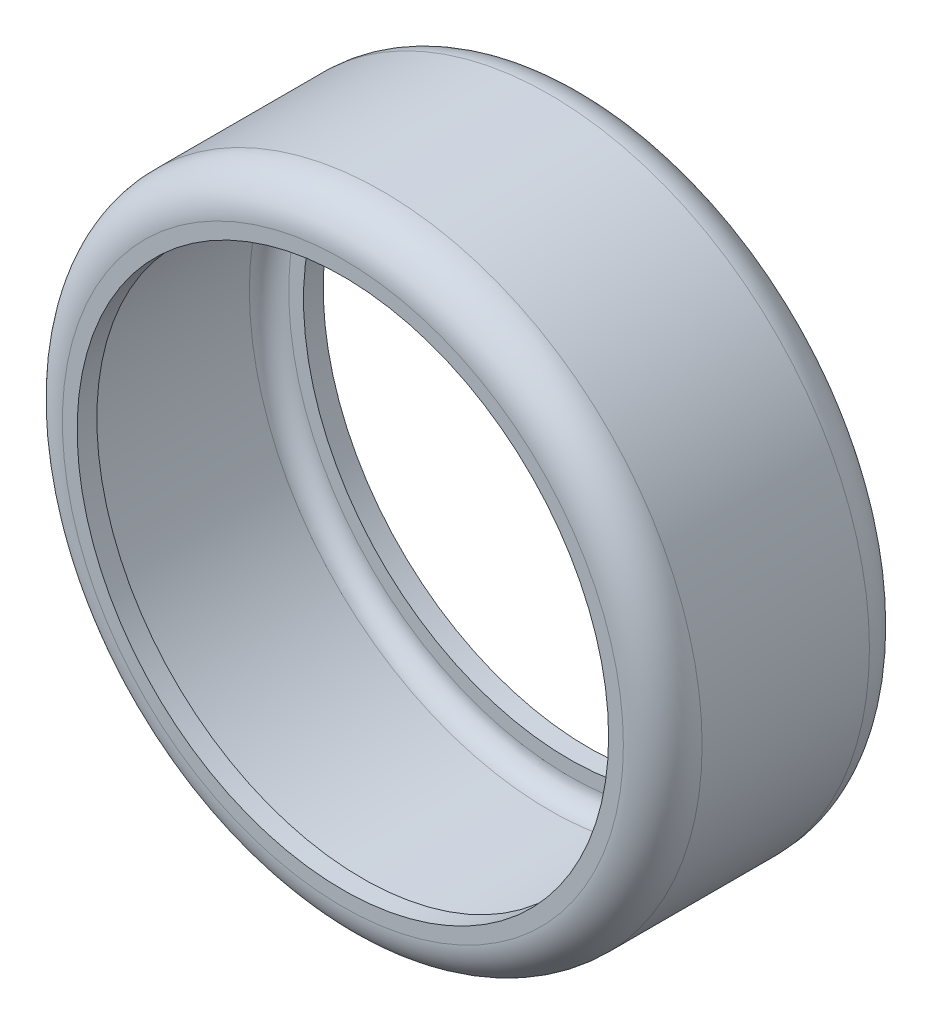
ISO-10303-21;
HEADER;
FILE_DESCRIPTION(('STEP AP214'),'2;1');
FILE_NAME('part.step','',(''),(''),'','','');
FILE_SCHEMA(('AUTOMOTIVE_DESIGN { 1 0 10303 214 1 1 1 1 }'));
ENDSEC;
DATA;
#1=APPLICATION_CONTEXT('core data for automotive mechanical design processes');
#2=APPLICATION_PROTOCOL_DEFINITION('international standard','automotive_design',2000,#1);
#3=PRODUCT_CONTEXT('',#1,'mechanical');
#4=PRODUCT('Part','Part','',(#3));
#5=PRODUCT_RELATED_PRODUCT_CATEGORY('part','',(#4));
#6=PRODUCT_DEFINITION_FORMATION('','',#4);
#7=PRODUCT_DEFINITION_CONTEXT('part definition',#1,'design');
#8=PRODUCT_DEFINITION('design','',#6,#7);
#9=PRODUCT_DEFINITION_SHAPE('','',#8);
#10=(LENGTH_UNIT() NAMED_UNIT(*) SI_UNIT(.MILLI.,.METRE.));
#11=(NAMED_UNIT(*) PLANE_ANGLE_UNIT() SI_UNIT($,.RADIAN.));
#12=(NAMED_UNIT(*) SI_UNIT($,.STERADIAN.) SOLID_ANGLE_UNIT());
#13=UNCERTAINTY_MEASURE_WITH_UNIT(LENGTH_MEASURE(1.E-05),#10,'distance_accuracy_value','');
#14=(GEOMETRIC_REPRESENTATION_CONTEXT(3) GLOBAL_UNCERTAINTY_ASSIGNED_CONTEXT((#13)) GLOBAL_UNIT_ASSIGNED_CONTEXT((#10,
#11,#12)) REPRESENTATION_CONTEXT('',''));
#15=CARTESIAN_POINT('',(0.,0.,0.));
#16=DIRECTION('',(0.,0.,1.));
#17=DIRECTION('',(1.,0.,0.));
#18=AXIS2_PLACEMENT_3D('',#15,#16,#17);
#19=CARTESIAN_POINT('',(0.,0.,50.));
#20=DIRECTION('',(0.,0.,-1.));
#21=DIRECTION('',(-1.,0.,0.));
#22=AXIS2_PLACEMENT_3D('',#19,#20,#21);
#23=CYLINDRICAL_SURFACE('',#22,54.);
#24=CARTESIAN_POINT('',(0.,0.,0.));
#25=DIRECTION('',(0.,0.,1.));
#26=DIRECTION('',(1.,0.,0.));
#27=AXIS2_PLACEMENT_3D('',#24,#25,#26);
#28=CIRCLE('',#27,54.);
#29=CARTESIAN_POINT('',(54.,0.,0.));
#30=VERTEX_POINT('',#29);
#31=EDGE_CURVE('E61',#30,#30,#28,.T.);
#32=ORIENTED_EDGE('',*,*,#31,.F.);
#33=EDGE_LOOP('',(#32));
#34=FACE_BOUND('',#33,.T.);
#35=CARTESIAN_POINT('',(0.,0.,4.));
#36=DIRECTION('',(0.,0.,1.));
#37=DIRECTION('',(1.,0.,0.));
#38=AXIS2_PLACEMENT_3D('',#35,#36,#37);
#39=CIRCLE('',#38,54.);
#40=CARTESIAN_POINT('',(54.,0.,4.));
#41=VERTEX_POINT('',#40);
#42=EDGE_CURVE('E67',#41,#41,#39,.T.);
#43=ORIENTED_EDGE('',*,*,#42,.T.);
#44=EDGE_LOOP('',(#43));
#45=FACE_BOUND('',#44,.T.);
#46=ADVANCED_FACE('F40',(#34,#45),#23,.F.);
#47=CARTESIAN_POINT('',(0.,0.,50.));
#48=DIRECTION('',(0.,0.,1.));
#49=DIRECTION('',(1.,0.,0.));
#50=AXIS2_PLACEMENT_3D('',#47,#48,#49);
#51=PLANE('',#50);
#52=CARTESIAN_POINT('',(0.,0.,50.));
#53=DIRECTION('',(0.,0.,1.));
#54=DIRECTION('',(1.,0.,0.));
#55=AXIS2_PLACEMENT_3D('',#52,#53,#54);
#56=CIRCLE('',#55,57.);
#57=CARTESIAN_POINT('',(57.,0.,50.));
#58=VERTEX_POINT('',#57);
#59=EDGE_CURVE('E11',#58,#58,#56,.T.);
#60=ORIENTED_EDGE('',*,*,#59,.T.);
#61=EDGE_LOOP('',(#60));
#62=FACE_BOUND('',#61,.T.);
#63=CARTESIAN_POINT('',(0.,0.,50.));
#64=DIRECTION('',(0.,0.,1.));
#65=DIRECTION('',(1.,0.,0.));
#66=AXIS2_PLACEMENT_3D('',#63,#64,#65);
#67=CIRCLE('',#66,54.);
#68=CARTESIAN_POINT('',(54.,0.,50.));
#69=VERTEX_POINT('',#68);
#70=EDGE_CURVE('E60',#69,#69,#67,.T.);
#71=ORIENTED_EDGE('',*,*,#70,.F.);
#72=EDGE_LOOP('',(#71));
#73=FACE_BOUND('',#72,.T.);
#74=ADVANCED_FACE('F102',(#62,#73),#51,.T.);
#75=CARTESIAN_POINT('',(0.,0.,0.));
#76=DIRECTION('',(0.,0.,1.));
#77=DIRECTION('',(1.,0.,0.));
#78=AXIS2_PLACEMENT_3D('',#75,#76,#77);
#79=PLANE('',#78);
#80=CARTESIAN_POINT('',(0.,0.,0.));
#81=DIRECTION('',(0.,0.,1.));
#82=DIRECTION('',(1.,0.,0.));
#83=AXIS2_PLACEMENT_3D('',#80,#81,#82);
#84=CIRCLE('',#83,57.);
#85=CARTESIAN_POINT('',(57.,0.,0.));
#86=VERTEX_POINT('',#85);
#87=EDGE_CURVE('E47',#86,#86,#84,.F.);
#88=ORIENTED_EDGE('',*,*,#87,.T.);
#89=EDGE_LOOP('',(#88));
#90=FACE_BOUND('',#89,.T.);
#91=ORIENTED_EDGE('',*,*,#31,.T.);
#92=EDGE_LOOP('',(#91));
#93=FACE_BOUND('',#92,.T.);
#94=ADVANCED_FACE('F104',(#90,#93),#79,.F.);
#95=CARTESIAN_POINT('',(0.,0.,50.));
#96=DIRECTION('',(0.,0.,-1.));
#97=DIRECTION('',(-1.,0.,0.));
#98=AXIS2_PLACEMENT_3D('',#95,#96,#97);
#99=CYLINDRICAL_SURFACE('',#98,65.);
#100=CARTESIAN_POINT('',(0.,0.,8.));
#101=DIRECTION('',(0.,0.,1.));
#102=DIRECTION('',(1.,0.,0.));
#103=AXIS2_PLACEMENT_3D('',#100,#101,#102);
#104=CIRCLE('',#103,65.);
#105=CARTESIAN_POINT('',(65.,0.,8.));
#106=VERTEX_POINT('',#105);
#107=EDGE_CURVE('E51',#106,#106,#104,.T.);
#108=ORIENTED_EDGE('',*,*,#107,.T.);
#109=EDGE_LOOP('',(#108));
#110=FACE_BOUND('',#109,.T.);
#111=CARTESIAN_POINT('',(0.,0.,42.));
#112=DIRECTION('',(0.,0.,1.));
#113=DIRECTION('',(1.,0.,0.));
#114=AXIS2_PLACEMENT_3D('',#111,#112,#113);
#115=CIRCLE('',#114,65.);
#116=CARTESIAN_POINT('',(65.,0.,42.));
#117=VERTEX_POINT('',#116);
#118=EDGE_CURVE('E55',#117,#117,#115,.F.);
#119=ORIENTED_EDGE('',*,*,#118,.T.);
#120=EDGE_LOOP('',(#119));
#121=FACE_BOUND('',#120,.T.);
#122=ADVANCED_FACE('F98',(#110,#121),#99,.T.);
#123=CARTESIAN_POINT('',(0.,0.,46.));
#124=DIRECTION('',(0.,0.,1.));
#125=DIRECTION('',(1.,0.,0.));
#126=AXIS2_PLACEMENT_3D('',#123,#124,#125);
#127=CIRCLE('',#126,54.);
#128=CARTESIAN_POINT('',(54.,0.,46.));
#129=VERTEX_POINT('',#128);
#130=EDGE_CURVE('E70',#129,#129,#127,.T.);
#131=ORIENTED_EDGE('',*,*,#130,.F.);
#132=EDGE_LOOP('',(#131));
#133=FACE_BOUND('',#132,.T.);
#134=ORIENTED_EDGE('',*,*,#70,.T.);
#135=EDGE_LOOP('',(#134));
#136=FACE_BOUND('',#135,.T.);
#137=ADVANCED_FACE('F94',(#133,#136),#23,.F.);
#138=CARTESIAN_POINT('',(0.,0.,8.));
#139=DIRECTION('',(0.,0.,1.));
#140=DIRECTION('',(1.,0.,0.));
#141=AXIS2_PLACEMENT_3D('',#138,#139,#140);
#142=TOROIDAL_SURFACE('',#141,57.,8.);
#143=ORIENTED_EDGE('',*,*,#87,.F.);
#144=EDGE_LOOP('',(#143));
#145=FACE_BOUND('',#144,.T.);
#146=ORIENTED_EDGE('',*,*,#107,.F.);
#147=EDGE_LOOP('',(#146));
#148=FACE_BOUND('',#147,.T.);
#149=ADVANCED_FACE('F97',(#145,#148),#142,.T.);
#150=CARTESIAN_POINT('',(0.,0.,42.));
#151=DIRECTION('',(0.,0.,1.));
#152=DIRECTION('',(1.,0.,0.));
#153=AXIS2_PLACEMENT_3D('',#150,#151,#152);
#154=TOROIDAL_SURFACE('',#153,57.,8.);
#155=ORIENTED_EDGE('',*,*,#118,.F.);
#156=EDGE_LOOP('',(#155));
#157=FACE_BOUND('',#156,.T.);
#158=ORIENTED_EDGE('',*,*,#59,.F.);
#159=EDGE_LOOP('',(#158));
#160=FACE_BOUND('',#159,.T.);
#161=ADVANCED_FACE('F42',(#157,#160),#154,.T.);
#162=CARTESIAN_POINT('',(0.,0.,46.));
#163=DIRECTION('',(0.,0.,1.));
#164=DIRECTION('',(1.,0.,0.));
#165=AXIS2_PLACEMENT_3D('',#162,#163,#164);
#166=PLANE('',#165);
#167=CARTESIAN_POINT('',(0.,0.,46.));
#168=DIRECTION('',(0.,0.,1.));
#169=DIRECTION('',(1.,0.,0.));
#170=AXIS2_PLACEMENT_3D('',#167,#168,#169);
#171=CIRCLE('',#170,57.);
#172=CARTESIAN_POINT('',(57.,0.,46.));
#173=VERTEX_POINT('',#172);
#174=EDGE_CURVE('E64',#173,#173,#171,.T.);
#175=ORIENTED_EDGE('',*,*,#174,.F.);
#176=EDGE_LOOP('',(#175));
#177=FACE_BOUND('',#176,.T.);
#178=ORIENTED_EDGE('',*,*,#130,.T.);
#179=EDGE_LOOP('',(#178));
#180=FACE_BOUND('',#179,.T.);
#181=ADVANCED_FACE('F87',(#177,#180),#166,.F.);
#182=CARTESIAN_POINT('',(0.,0.,4.));
#183=DIRECTION('',(0.,0.,1.));
#184=DIRECTION('',(1.,0.,0.));
#185=AXIS2_PLACEMENT_3D('',#182,#183,#184);
#186=PLANE('',#185);
#187=CARTESIAN_POINT('',(0.,0.,4.));
#188=DIRECTION('',(0.,0.,1.));
#189=DIRECTION('',(1.,0.,0.));
#190=AXIS2_PLACEMENT_3D('',#187,#188,#189);
#191=CIRCLE('',#190,57.);
#192=CARTESIAN_POINT('',(57.,0.,4.));
#193=VERTEX_POINT('',#192);
#194=EDGE_CURVE('E74',#193,#193,#191,.F.);
#195=ORIENTED_EDGE('',*,*,#194,.F.);
#196=EDGE_LOOP('',(#195));
#197=FACE_BOUND('',#196,.T.);
#198=ORIENTED_EDGE('',*,*,#42,.F.);
#199=EDGE_LOOP('',(#198));
#200=FACE_BOUND('',#199,.T.);
#201=ADVANCED_FACE('F90',(#197,#200),#186,.T.);
#202=CARTESIAN_POINT('',(0.,0.,50.));
#203=DIRECTION('',(0.,0.,-1.));
#204=DIRECTION('',(-1.,0.,0.));
#205=AXIS2_PLACEMENT_3D('',#202,#203,#204);
#206=CYLINDRICAL_SURFACE('',#205,61.);
#207=CARTESIAN_POINT('',(0.,0.,8.));
#208=DIRECTION('',(0.,0.,-1.));
#209=DIRECTION('',(-1.,0.,0.));
#210=AXIS2_PLACEMENT_3D('',#207,#208,#209);
#211=CIRCLE('',#210,61.);
#212=CARTESIAN_POINT('',(-61.,0.,8.));
#213=VERTEX_POINT('',#212);
#214=EDGE_CURVE('E77',#213,#213,#211,.F.);
#215=ORIENTED_EDGE('',*,*,#214,.F.);
#216=EDGE_LOOP('',(#215));
#217=FACE_BOUND('',#216,.T.);
#218=CARTESIAN_POINT('',(0.,0.,42.));
#219=DIRECTION('',(0.,0.,-1.));
#220=DIRECTION('',(-1.,0.,0.));
#221=AXIS2_PLACEMENT_3D('',#218,#219,#220);
#222=CIRCLE('',#221,61.);
#223=CARTESIAN_POINT('',(-61.,0.,42.));
#224=VERTEX_POINT('',#223);
#225=EDGE_CURVE('E73',#224,#224,#222,.T.);
#226=ORIENTED_EDGE('',*,*,#225,.F.);
#227=EDGE_LOOP('',(#226));
#228=FACE_BOUND('',#227,.T.);
#229=ADVANCED_FACE('F141',(#217,#228),#206,.F.);
#230=CARTESIAN_POINT('',(0.,0.,8.));
#231=DIRECTION('',(0.,0.,1.));
#232=DIRECTION('',(1.,0.,0.));
#233=AXIS2_PLACEMENT_3D('',#230,#231,#232);
#234=TOROIDAL_SURFACE('',#233,57.,4.);
#235=ORIENTED_EDGE('',*,*,#194,.T.);
#236=EDGE_LOOP('',(#235));
#237=FACE_BOUND('',#236,.T.);
#238=ORIENTED_EDGE('',*,*,#214,.T.);
#239=EDGE_LOOP('',(#238));
#240=FACE_BOUND('',#239,.T.);
#241=ADVANCED_FACE('F149',(#237,#240),#234,.F.);
#242=CARTESIAN_POINT('',(0.,0.,42.));
#243=DIRECTION('',(0.,0.,1.));
#244=DIRECTION('',(1.,0.,0.));
#245=AXIS2_PLACEMENT_3D('',#242,#243,#244);
#246=TOROIDAL_SURFACE('',#245,57.,4.);
#247=ORIENTED_EDGE('',*,*,#225,.T.);
#248=EDGE_LOOP('',(#247));
#249=FACE_BOUND('',#248,.T.);
#250=ORIENTED_EDGE('',*,*,#174,.T.);
#251=EDGE_LOOP('',(#250));
#252=FACE_BOUND('',#251,.T.);
#253=ADVANCED_FACE('F85',(#249,#252),#246,.F.);
#254=CLOSED_SHELL('',(#46,#74,#94,#122,#137,#149,#161,#181,#201,#229,#241,#253));
#255=MANIFOLD_SOLID_BREP('B2',#254);
#256=ADVANCED_BREP_SHAPE_REPRESENTATION('',(#18,#255),#14);
#257=SHAPE_DEFINITION_REPRESENTATION(#9,#256);
ENDSEC;
END-ISO-10303-21;
